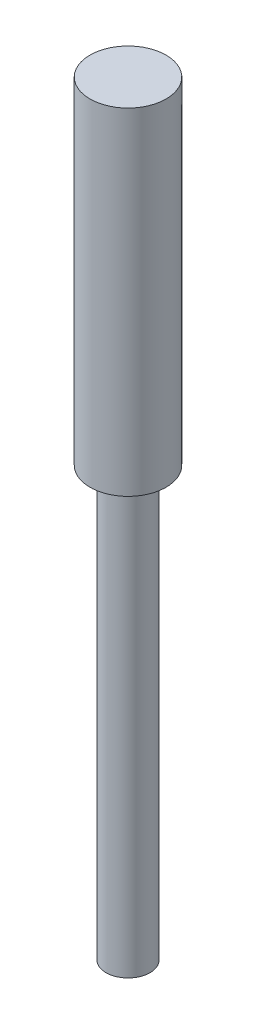
ISO-10303-21;
HEADER;
FILE_DESCRIPTION(('STEP AP214'),'2;1');
FILE_NAME('part.step','',(''),(''),'','','');
FILE_SCHEMA(('AUTOMOTIVE_DESIGN { 1 0 10303 214 1 1 1 1 }'));
ENDSEC;
DATA;
#1=APPLICATION_CONTEXT('core data for automotive mechanical design processes');
#2=APPLICATION_PROTOCOL_DEFINITION('international standard','automotive_design',2000,#1);
#3=PRODUCT_CONTEXT('',#1,'mechanical');
#4=PRODUCT('Part','Part','',(#3));
#5=PRODUCT_RELATED_PRODUCT_CATEGORY('part','',(#4));
#6=PRODUCT_DEFINITION_FORMATION('','',#4);
#7=PRODUCT_DEFINITION_CONTEXT('part definition',#1,'design');
#8=PRODUCT_DEFINITION('design','',#6,#7);
#9=PRODUCT_DEFINITION_SHAPE('','',#8);
#10=(LENGTH_UNIT() NAMED_UNIT(*) SI_UNIT(.MILLI.,.METRE.));
#11=(NAMED_UNIT(*) PLANE_ANGLE_UNIT() SI_UNIT($,.RADIAN.));
#12=(NAMED_UNIT(*) SI_UNIT($,.STERADIAN.) SOLID_ANGLE_UNIT());
#13=UNCERTAINTY_MEASURE_WITH_UNIT(LENGTH_MEASURE(1.E-05),#10,'distance_accuracy_value','');
#14=(GEOMETRIC_REPRESENTATION_CONTEXT(3) GLOBAL_UNCERTAINTY_ASSIGNED_CONTEXT((#13)) GLOBAL_UNIT_ASSIGNED_CONTEXT((#10,
#11,#12)) REPRESENTATION_CONTEXT('',''));
#15=CARTESIAN_POINT('',(0.,0.,0.));
#16=DIRECTION('',(0.,0.,1.));
#17=DIRECTION('',(1.,0.,0.));
#18=AXIS2_PLACEMENT_3D('',#15,#16,#17);
#19=CARTESIAN_POINT('',(0.,0.,0.));
#20=DIRECTION('',(0.,-1.,0.));
#21=DIRECTION('',(0.,0.,-1.));
#22=AXIS2_PLACEMENT_3D('',#19,#20,#21);
#23=PLANE('',#22);
#24=CARTESIAN_POINT('',(0.,0.,0.));
#25=DIRECTION('',(0.,-1.,0.));
#26=DIRECTION('',(0.,0.,-1.));
#27=AXIS2_PLACEMENT_3D('',#24,#25,#26);
#28=CIRCLE('',#27,1.375);
#29=CARTESIAN_POINT('',(0.,0.,-1.375));
#30=VERTEX_POINT('',#29);
#31=EDGE_CURVE('E10',#30,#30,#28,.T.);
#32=ORIENTED_EDGE('',*,*,#31,.T.);
#33=EDGE_LOOP('',(#32));
#34=FACE_BOUND('',#33,.T.);
#35=ADVANCED_FACE('F31',(#34),#23,.T.);
#36=CARTESIAN_POINT('',(0.,0.,0.));
#37=DIRECTION('',(0.,-1.,0.));
#38=DIRECTION('',(0.,0.,-1.));
#39=AXIS2_PLACEMENT_3D('',#36,#37,#38);
#40=CYLINDRICAL_SURFACE('',#39,1.375);
#41=CARTESIAN_POINT('',(0.,26.75,0.));
#42=DIRECTION('',(0.,-1.,0.));
#43=DIRECTION('',(0.,0.,-1.));
#44=AXIS2_PLACEMENT_3D('',#41,#42,#43);
#45=CIRCLE('',#44,1.375);
#46=CARTESIAN_POINT('',(0.,26.75,-1.375));
#47=VERTEX_POINT('',#46);
#48=EDGE_CURVE('E37',#47,#47,#45,.T.);
#49=ORIENTED_EDGE('',*,*,#48,.T.);
#50=EDGE_LOOP('',(#49));
#51=FACE_BOUND('',#50,.T.);
#52=ORIENTED_EDGE('',*,*,#31,.F.);
#53=EDGE_LOOP('',(#52));
#54=FACE_BOUND('',#53,.T.);
#55=ADVANCED_FACE('F63',(#51,#54),#40,.T.);
#56=CARTESIAN_POINT('',(1.375,26.75,0.));
#57=DIRECTION('',(0.,-1.,0.));
#58=DIRECTION('',(0.,0.,-1.));
#59=AXIS2_PLACEMENT_3D('',#56,#57,#58);
#60=PLANE('',#59);
#61=CARTESIAN_POINT('',(0.,26.75,0.));
#62=DIRECTION('',(0.,-1.,0.));
#63=DIRECTION('',(0.,0.,-1.));
#64=AXIS2_PLACEMENT_3D('',#61,#62,#63);
#65=CIRCLE('',#64,2.375);
#66=CARTESIAN_POINT('',(0.,26.75,-2.375));
#67=VERTEX_POINT('',#66);
#68=EDGE_CURVE('E41',#67,#67,#65,.T.);
#69=ORIENTED_EDGE('',*,*,#68,.T.);
#70=EDGE_LOOP('',(#69));
#71=FACE_BOUND('',#70,.T.);
#72=ORIENTED_EDGE('',*,*,#48,.F.);
#73=EDGE_LOOP('',(#72));
#74=FACE_BOUND('',#73,.T.);
#75=ADVANCED_FACE('F60',(#71,#74),#60,.T.);
#76=CARTESIAN_POINT('',(0.,0.,0.));
#77=DIRECTION('',(0.,-1.,0.));
#78=DIRECTION('',(0.,0.,-1.));
#79=AXIS2_PLACEMENT_3D('',#76,#77,#78);
#80=CYLINDRICAL_SURFACE('',#79,2.375);
#81=CARTESIAN_POINT('',(0.,47.75,0.));
#82=DIRECTION('',(0.,-1.,0.));
#83=DIRECTION('',(0.,0.,-1.));
#84=AXIS2_PLACEMENT_3D('',#81,#82,#83);
#85=CIRCLE('',#84,2.375);
#86=CARTESIAN_POINT('',(0.,47.75,-2.375));
#87=VERTEX_POINT('',#86);
#88=EDGE_CURVE('E45',#87,#87,#85,.T.);
#89=ORIENTED_EDGE('',*,*,#88,.T.);
#90=EDGE_LOOP('',(#89));
#91=FACE_BOUND('',#90,.T.);
#92=ORIENTED_EDGE('',*,*,#68,.F.);
#93=EDGE_LOOP('',(#92));
#94=FACE_BOUND('',#93,.T.);
#95=ADVANCED_FACE('F51',(#91,#94),#80,.T.);
#96=CARTESIAN_POINT('',(2.375,47.75,0.));
#97=DIRECTION('',(0.,1.,0.));
#98=DIRECTION('',(0.,0.,1.));
#99=AXIS2_PLACEMENT_3D('',#96,#97,#98);
#100=PLANE('',#99);
#101=ORIENTED_EDGE('',*,*,#88,.F.);
#102=EDGE_LOOP('',(#101));
#103=FACE_BOUND('',#102,.T.);
#104=ADVANCED_FACE('F54',(#103),#100,.T.);
#105=CLOSED_SHELL('',(#35,#55,#75,#95,#104));
#106=MANIFOLD_SOLID_BREP('B2',#105);
#107=ADVANCED_BREP_SHAPE_REPRESENTATION('',(#18,#106),#14);
#108=SHAPE_DEFINITION_REPRESENTATION(#9,#107);
ENDSEC;
END-ISO-10303-21;
